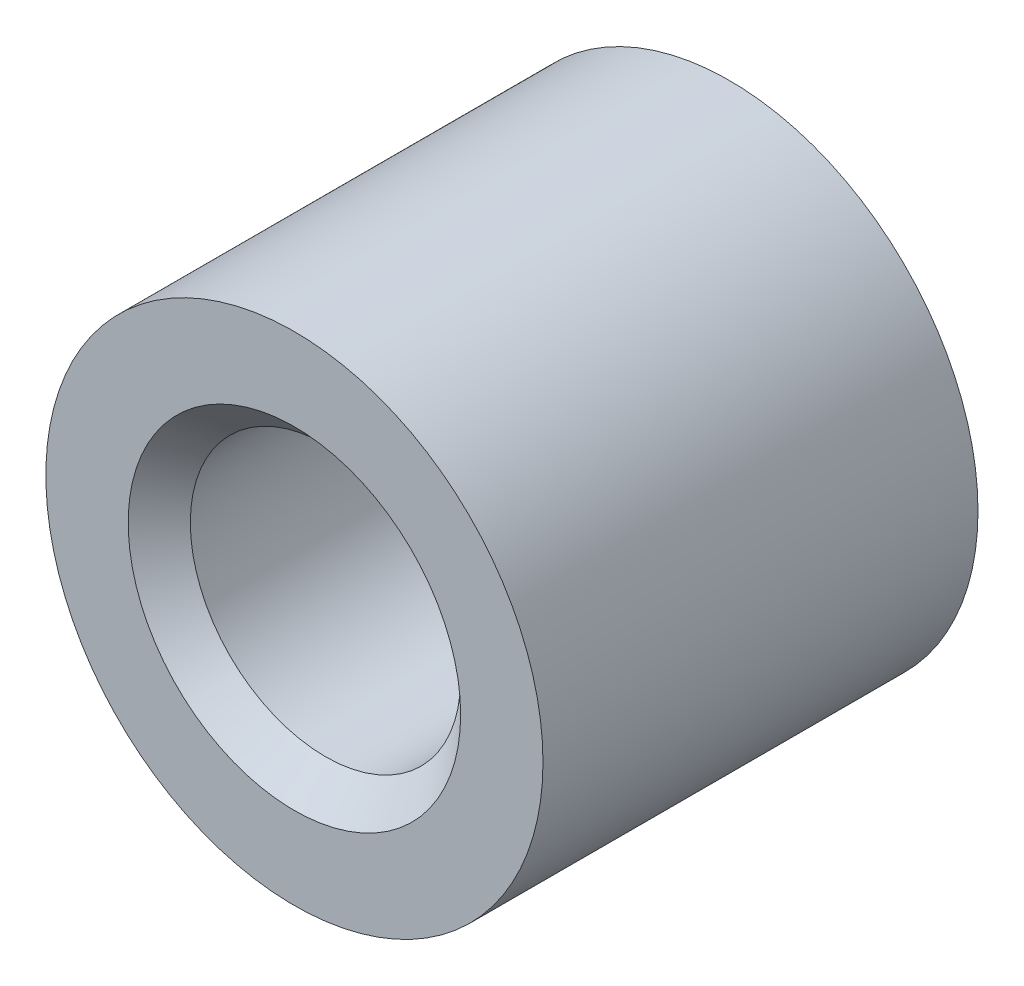
ISO-10303-21;
HEADER;
FILE_DESCRIPTION(('STEP AP214'),'2;1');
FILE_NAME('part.step','',(''),(''),'','','');
FILE_SCHEMA(('AUTOMOTIVE_DESIGN { 1 0 10303 214 1 1 1 1 }'));
ENDSEC;
DATA;
#1=APPLICATION_CONTEXT('core data for automotive mechanical design processes');
#2=APPLICATION_PROTOCOL_DEFINITION('international standard','automotive_design',2000,#1);
#3=PRODUCT_CONTEXT('',#1,'mechanical');
#4=PRODUCT('Part','Part','',(#3));
#5=PRODUCT_RELATED_PRODUCT_CATEGORY('part','',(#4));
#6=PRODUCT_DEFINITION_FORMATION('','',#4);
#7=PRODUCT_DEFINITION_CONTEXT('part definition',#1,'design');
#8=PRODUCT_DEFINITION('design','',#6,#7);
#9=PRODUCT_DEFINITION_SHAPE('','',#8);
#10=(LENGTH_UNIT() NAMED_UNIT(*) SI_UNIT(.MILLI.,.METRE.));
#11=(NAMED_UNIT(*) PLANE_ANGLE_UNIT() SI_UNIT($,.RADIAN.));
#12=(NAMED_UNIT(*) SI_UNIT($,.STERADIAN.) SOLID_ANGLE_UNIT());
#13=UNCERTAINTY_MEASURE_WITH_UNIT(LENGTH_MEASURE(1.E-05),#10,'distance_accuracy_value','');
#14=(GEOMETRIC_REPRESENTATION_CONTEXT(3) GLOBAL_UNCERTAINTY_ASSIGNED_CONTEXT((#13)) GLOBAL_UNIT_ASSIGNED_CONTEXT((#10,
#11,#12)) REPRESENTATION_CONTEXT('',''));
#15=CARTESIAN_POINT('',(0.,0.,0.));
#16=DIRECTION('',(0.,0.,1.));
#17=DIRECTION('',(1.,0.,0.));
#18=AXIS2_PLACEMENT_3D('',#15,#16,#17);
#19=CARTESIAN_POINT('',(0.,0.,14.));
#20=DIRECTION('',(0.,0.,1.));
#21=DIRECTION('',(1.,0.,0.));
#22=AXIS2_PLACEMENT_3D('',#19,#20,#21);
#23=PLANE('',#22);
#24=CARTESIAN_POINT('',(0.,0.,14.));
#25=DIRECTION('',(0.,0.,1.));
#26=DIRECTION('',(1.,0.,0.));
#27=AXIS2_PLACEMENT_3D('',#24,#25,#26);
#28=CIRCLE('',#27,5.35);
#29=CARTESIAN_POINT('',(5.35,0.,14.));
#30=VERTEX_POINT('',#29);
#31=EDGE_CURVE('E46',#30,#30,#28,.F.);
#32=ORIENTED_EDGE('',*,*,#31,.T.);
#33=EDGE_LOOP('',(#32));
#34=FACE_BOUND('',#33,.T.);
#35=CARTESIAN_POINT('',(0.,0.,14.));
#36=DIRECTION('',(0.,0.,1.));
#37=DIRECTION('',(1.,0.,0.));
#38=AXIS2_PLACEMENT_3D('',#35,#36,#37);
#39=CIRCLE('',#38,8.);
#40=CARTESIAN_POINT('',(8.,0.,14.));
#41=VERTEX_POINT('',#40);
#42=EDGE_CURVE('E64',#41,#41,#39,.T.);
#43=ORIENTED_EDGE('',*,*,#42,.T.);
#44=EDGE_LOOP('',(#43));
#45=FACE_BOUND('',#44,.T.);
#46=ADVANCED_FACE('F38',(#34,#45),#23,.T.);
#47=CARTESIAN_POINT('',(0.,0.,0.));
#48=DIRECTION('',(0.,0.,1.));
#49=DIRECTION('',(1.,0.,0.));
#50=AXIS2_PLACEMENT_3D('',#47,#48,#49);
#51=PLANE('',#50);
#52=CARTESIAN_POINT('',(0.,0.,0.));
#53=DIRECTION('',(0.,0.,1.));
#54=DIRECTION('',(1.,0.,0.));
#55=AXIS2_PLACEMENT_3D('',#52,#53,#54);
#56=CIRCLE('',#55,5.35);
#57=CARTESIAN_POINT('',(5.35,0.,0.));
#58=VERTEX_POINT('',#57);
#59=EDGE_CURVE('E10',#58,#58,#56,.T.);
#60=ORIENTED_EDGE('',*,*,#59,.T.);
#61=EDGE_LOOP('',(#60));
#62=FACE_BOUND('',#61,.T.);
#63=CARTESIAN_POINT('',(0.,0.,0.));
#64=DIRECTION('',(0.,0.,1.));
#65=DIRECTION('',(1.,0.,0.));
#66=AXIS2_PLACEMENT_3D('',#63,#64,#65);
#67=CIRCLE('',#66,8.);
#68=CARTESIAN_POINT('',(8.,0.,0.));
#69=VERTEX_POINT('',#68);
#70=EDGE_CURVE('E65',#69,#69,#67,.T.);
#71=ORIENTED_EDGE('',*,*,#70,.F.);
#72=EDGE_LOOP('',(#71));
#73=FACE_BOUND('',#72,.T.);
#74=ADVANCED_FACE('F76',(#62,#73),#51,.F.);
#75=CARTESIAN_POINT('',(0.,0.,14.));
#76=DIRECTION('',(0.,0.,-1.));
#77=DIRECTION('',(-1.,0.,0.));
#78=AXIS2_PLACEMENT_3D('',#75,#76,#77);
#79=CYLINDRICAL_SURFACE('',#78,8.);
#80=ORIENTED_EDGE('',*,*,#42,.F.);
#81=EDGE_LOOP('',(#80));
#82=FACE_BOUND('',#81,.T.);
#83=ORIENTED_EDGE('',*,*,#70,.T.);
#84=EDGE_LOOP('',(#83));
#85=FACE_BOUND('',#84,.T.);
#86=ADVANCED_FACE('F72',(#82,#85),#79,.T.);
#87=CARTESIAN_POINT('',(0.,0.,14.));
#88=DIRECTION('',(0.,0.,-1.));
#89=DIRECTION('',(-1.,0.,0.));
#90=AXIS2_PLACEMENT_3D('',#87,#88,#89);
#91=CYLINDRICAL_SURFACE('',#90,4.35);
#92=CARTESIAN_POINT('',(0.,0.,13.));
#93=DIRECTION('',(0.,0.,1.));
#94=DIRECTION('',(1.,0.,0.));
#95=AXIS2_PLACEMENT_3D('',#92,#93,#94);
#96=CIRCLE('',#95,4.35);
#97=CARTESIAN_POINT('',(4.35,0.,13.));
#98=VERTEX_POINT('',#97);
#99=EDGE_CURVE('E53',#98,#98,#96,.T.);
#100=ORIENTED_EDGE('',*,*,#99,.T.);
#101=EDGE_LOOP('',(#100));
#102=FACE_BOUND('',#101,.T.);
#103=CARTESIAN_POINT('',(0.,0.,0.999999999999999));
#104=DIRECTION('',(0.,0.,1.));
#105=DIRECTION('',(1.,0.,0.));
#106=AXIS2_PLACEMENT_3D('',#103,#104,#105);
#107=CIRCLE('',#106,4.35);
#108=CARTESIAN_POINT('',(4.35,0.,0.999999999999999));
#109=VERTEX_POINT('',#108);
#110=EDGE_CURVE('E59',#109,#109,#107,.F.);
#111=ORIENTED_EDGE('',*,*,#110,.T.);
#112=EDGE_LOOP('',(#111));
#113=FACE_BOUND('',#112,.T.);
#114=ADVANCED_FACE('F75',(#102,#113),#91,.F.);
#115=CARTESIAN_POINT('',(0.,0.,13.));
#116=DIRECTION('',(0.,0.,1.));
#117=DIRECTION('',(1.,0.,0.));
#118=AXIS2_PLACEMENT_3D('',#115,#116,#117);
#119=CONICAL_SURFACE('',#118,4.35,0.78539816339745);
#120=ORIENTED_EDGE('',*,*,#31,.F.);
#121=EDGE_LOOP('',(#120));
#122=FACE_BOUND('',#121,.T.);
#123=ORIENTED_EDGE('',*,*,#99,.F.);
#124=EDGE_LOOP('',(#123));
#125=FACE_BOUND('',#124,.T.);
#126=ADVANCED_FACE('F88',(#122,#125),#119,.F.);
#127=CARTESIAN_POINT('',(0.,0.,0.));
#128=DIRECTION('',(0.,0.,-1.));
#129=DIRECTION('',(-1.,0.,0.));
#130=AXIS2_PLACEMENT_3D('',#127,#128,#129);
#131=CONICAL_SURFACE('',#130,5.35,0.785398163397448);
#132=ORIENTED_EDGE('',*,*,#110,.F.);
#133=EDGE_LOOP('',(#132));
#134=FACE_BOUND('',#133,.T.);
#135=ORIENTED_EDGE('',*,*,#59,.F.);
#136=EDGE_LOOP('',(#135));
#137=FACE_BOUND('',#136,.T.);
#138=ADVANCED_FACE('F40',(#134,#137),#131,.F.);
#139=CLOSED_SHELL('',(#46,#74,#86,#114,#126,#138));
#140=MANIFOLD_SOLID_BREP('B2',#139);
#141=ADVANCED_BREP_SHAPE_REPRESENTATION('',(#18,#140),#14);
#142=SHAPE_DEFINITION_REPRESENTATION(#9,#141);
ENDSEC;
END-ISO-10303-21;
